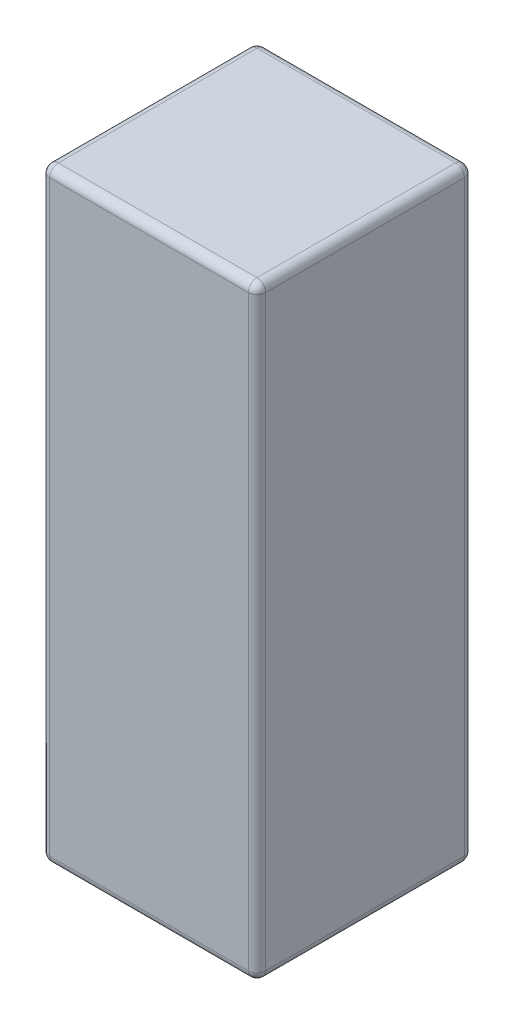
ISO-10303-21;
HEADER;
FILE_DESCRIPTION(('STEP AP214'),'2;1');
FILE_NAME('part.step','',(''),(''),'','','');
FILE_SCHEMA(('AUTOMOTIVE_DESIGN { 1 0 10303 214 1 1 1 1 }'));
ENDSEC;
DATA;
#1=APPLICATION_CONTEXT('core data for automotive mechanical design processes');
#2=APPLICATION_PROTOCOL_DEFINITION('international standard','automotive_design',2000,#1);
#3=PRODUCT_CONTEXT('',#1,'mechanical');
#4=PRODUCT('Part','Part','',(#3));
#5=PRODUCT_RELATED_PRODUCT_CATEGORY('part','',(#4));
#6=PRODUCT_DEFINITION_FORMATION('','',#4);
#7=PRODUCT_DEFINITION_CONTEXT('part definition',#1,'design');
#8=PRODUCT_DEFINITION('design','',#6,#7);
#9=PRODUCT_DEFINITION_SHAPE('','',#8);
#10=(LENGTH_UNIT() NAMED_UNIT(*) SI_UNIT(.MILLI.,.METRE.));
#11=(NAMED_UNIT(*) PLANE_ANGLE_UNIT() SI_UNIT($,.RADIAN.));
#12=(NAMED_UNIT(*) SI_UNIT($,.STERADIAN.) SOLID_ANGLE_UNIT());
#13=UNCERTAINTY_MEASURE_WITH_UNIT(LENGTH_MEASURE(1.E-05),#10,'distance_accuracy_value','');
#14=(GEOMETRIC_REPRESENTATION_CONTEXT(3) GLOBAL_UNCERTAINTY_ASSIGNED_CONTEXT((#13)) GLOBAL_UNIT_ASSIGNED_CONTEXT((#10,
#11,#12)) REPRESENTATION_CONTEXT('',''));
#15=CARTESIAN_POINT('',(0.,0.,0.));
#16=DIRECTION('',(0.,0.,1.));
#17=DIRECTION('',(1.,0.,0.));
#18=AXIS2_PLACEMENT_3D('',#15,#16,#17);
#19=CARTESIAN_POINT('',(25.,70.,25.));
#20=DIRECTION('',(-1.,0.,0.));
#21=DIRECTION('',(0.,0.,1.));
#22=AXIS2_PLACEMENT_3D('',#19,#20,#21);
#23=PLANE('',#22);
#24=DIRECTION('',(0.,0.,-1.));
#25=VECTOR('',#24,1.);
#26=CARTESIAN_POINT('',(25.,-68.,-25.));
#27=LINE('',#26,#25);
#28=CARTESIAN_POINT('',(25.,-68.,23.));
#29=VERTEX_POINT('',#28);
#30=CARTESIAN_POINT('',(25.,-68.,-23.));
#31=VERTEX_POINT('',#30);
#32=EDGE_CURVE('E242',#29,#31,#27,.T.);
#33=ORIENTED_EDGE('',*,*,#32,.T.);
#34=DIRECTION('',(0.,-1.,0.));
#35=VECTOR('',#34,1.);
#36=CARTESIAN_POINT('',(25.,70.,-23.));
#37=LINE('',#36,#35);
#38=CARTESIAN_POINT('',(25.,68.,-23.));
#39=VERTEX_POINT('',#38);
#40=EDGE_CURVE('E189',#31,#39,#37,.F.);
#41=ORIENTED_EDGE('',*,*,#40,.T.);
#42=DIRECTION('',(0.,0.,-1.));
#43=VECTOR('',#42,1.);
#44=CARTESIAN_POINT('',(25.,68.,25.));
#45=LINE('',#44,#43);
#46=CARTESIAN_POINT('',(25.,68.,23.));
#47=VERTEX_POINT('',#46);
#48=EDGE_CURVE('E239',#39,#47,#45,.F.);
#49=ORIENTED_EDGE('',*,*,#48,.T.);
#50=DIRECTION('',(0.,-1.,0.));
#51=VECTOR('',#50,1.);
#52=CARTESIAN_POINT('',(25.,70.,23.));
#53=LINE('',#52,#51);
#54=EDGE_CURVE('E187',#47,#29,#53,.T.);
#55=ORIENTED_EDGE('',*,*,#54,.T.);
#56=EDGE_LOOP('',(#33,#41,#49,#55));
#57=FACE_BOUND('',#56,.T.);
#58=ADVANCED_FACE('F36',(#57),#23,.F.);
#59=CARTESIAN_POINT('',(-25.,70.,-25.));
#60=DIRECTION('',(0.,0.,1.));
#61=DIRECTION('',(1.,0.,0.));
#62=AXIS2_PLACEMENT_3D('',#59,#60,#61);
#63=PLANE('',#62);
#64=DIRECTION('',(-1.,0.,0.));
#65=VECTOR('',#64,1.);
#66=CARTESIAN_POINT('',(-25.,-68.,-25.));
#67=LINE('',#66,#65);
#68=CARTESIAN_POINT('',(23.,-68.,-25.));
#69=VERTEX_POINT('',#68);
#70=CARTESIAN_POINT('',(-23.,-68.,-25.));
#71=VERTEX_POINT('',#70);
#72=EDGE_CURVE('E135',#69,#71,#67,.T.);
#73=ORIENTED_EDGE('',*,*,#72,.T.);
#74=DIRECTION('',(0.,-1.,0.));
#75=VECTOR('',#74,1.);
#76=CARTESIAN_POINT('',(-23.,70.,-25.));
#77=LINE('',#76,#75);
#78=CARTESIAN_POINT('',(-23.,68.,-25.));
#79=VERTEX_POINT('',#78);
#80=EDGE_CURVE('E185',#71,#79,#77,.F.);
#81=ORIENTED_EDGE('',*,*,#80,.T.);
#82=DIRECTION('',(-1.,0.,0.));
#83=VECTOR('',#82,1.);
#84=CARTESIAN_POINT('',(-25.,68.,-25.));
#85=LINE('',#84,#83);
#86=CARTESIAN_POINT('',(23.,68.,-25.));
#87=VERTEX_POINT('',#86);
#88=EDGE_CURVE('E197',#79,#87,#85,.F.);
#89=ORIENTED_EDGE('',*,*,#88,.T.);
#90=DIRECTION('',(0.,-1.,0.));
#91=VECTOR('',#90,1.);
#92=CARTESIAN_POINT('',(23.,70.,-25.));
#93=LINE('',#92,#91);
#94=EDGE_CURVE('E183',#87,#69,#93,.T.);
#95=ORIENTED_EDGE('',*,*,#94,.T.);
#96=EDGE_LOOP('',(#73,#81,#89,#95));
#97=FACE_BOUND('',#96,.T.);
#98=ADVANCED_FACE('F303',(#97),#63,.F.);
#99=CARTESIAN_POINT('',(-25.,70.,25.));
#100=DIRECTION('',(1.,0.,0.));
#101=DIRECTION('',(0.,0.,-1.));
#102=AXIS2_PLACEMENT_3D('',#99,#100,#101);
#103=PLANE('',#102);
#104=DIRECTION('',(0.,0.,1.));
#105=VECTOR('',#104,1.);
#106=CARTESIAN_POINT('',(-25.,68.,25.));
#107=LINE('',#106,#105);
#108=CARTESIAN_POINT('',(-25.,68.,23.));
#109=VERTEX_POINT('',#108);
#110=CARTESIAN_POINT('',(-25.,68.,-23.));
#111=VERTEX_POINT('',#110);
#112=EDGE_CURVE('E160',#109,#111,#107,.F.);
#113=ORIENTED_EDGE('',*,*,#112,.T.);
#114=DIRECTION('',(0.,-1.,0.));
#115=VECTOR('',#114,1.);
#116=CARTESIAN_POINT('',(-25.,70.,-23.));
#117=LINE('',#116,#115);
#118=CARTESIAN_POINT('',(-25.,-68.,-23.));
#119=VERTEX_POINT('',#118);
#120=EDGE_CURVE('E181',#111,#119,#117,.T.);
#121=ORIENTED_EDGE('',*,*,#120,.T.);
#122=DIRECTION('',(0.,0.,1.));
#123=VECTOR('',#122,1.);
#124=CARTESIAN_POINT('',(-25.,-68.,25.));
#125=LINE('',#124,#123);
#126=CARTESIAN_POINT('',(-25.,-68.,23.));
#127=VERTEX_POINT('',#126);
#128=EDGE_CURVE('E234',#119,#127,#125,.T.);
#129=ORIENTED_EDGE('',*,*,#128,.T.);
#130=DIRECTION('',(0.,-1.,0.));
#131=VECTOR('',#130,1.);
#132=CARTESIAN_POINT('',(-25.,70.,23.));
#133=LINE('',#132,#131);
#134=EDGE_CURVE('E179',#127,#109,#133,.F.);
#135=ORIENTED_EDGE('',*,*,#134,.T.);
#136=EDGE_LOOP('',(#113,#121,#129,#135));
#137=FACE_BOUND('',#136,.T.);
#138=ADVANCED_FACE('F299',(#137),#103,.F.);
#139=CARTESIAN_POINT('',(-25.,70.,25.));
#140=DIRECTION('',(0.,0.,-1.));
#141=DIRECTION('',(-1.,0.,0.));
#142=AXIS2_PLACEMENT_3D('',#139,#140,#141);
#143=PLANE('',#142);
#144=DIRECTION('',(1.,0.,0.));
#145=VECTOR('',#144,1.);
#146=CARTESIAN_POINT('',(25.,-68.,25.));
#147=LINE('',#146,#145);
#148=CARTESIAN_POINT('',(-23.,-68.,25.));
#149=VERTEX_POINT('',#148);
#150=CARTESIAN_POINT('',(23.,-68.,25.));
#151=VERTEX_POINT('',#150);
#152=EDGE_CURVE('E222',#149,#151,#147,.T.);
#153=ORIENTED_EDGE('',*,*,#152,.T.);
#154=DIRECTION('',(0.,-1.,0.));
#155=VECTOR('',#154,1.);
#156=CARTESIAN_POINT('',(23.,70.,25.));
#157=LINE('',#156,#155);
#158=CARTESIAN_POINT('',(23.,68.,25.));
#159=VERTEX_POINT('',#158);
#160=EDGE_CURVE('E11',#151,#159,#157,.F.);
#161=ORIENTED_EDGE('',*,*,#160,.T.);
#162=DIRECTION('',(1.,0.,0.));
#163=VECTOR('',#162,1.);
#164=CARTESIAN_POINT('',(-25.,68.,25.));
#165=LINE('',#164,#163);
#166=CARTESIAN_POINT('',(-23.,68.,25.));
#167=VERTEX_POINT('',#166);
#168=EDGE_CURVE('E236',#159,#167,#165,.F.);
#169=ORIENTED_EDGE('',*,*,#168,.T.);
#170=DIRECTION('',(0.,-1.,0.));
#171=VECTOR('',#170,1.);
#172=CARTESIAN_POINT('',(-23.,70.,25.));
#173=LINE('',#172,#171);
#174=EDGE_CURVE('E45',#167,#149,#173,.T.);
#175=ORIENTED_EDGE('',*,*,#174,.T.);
#176=EDGE_LOOP('',(#153,#161,#169,#175));
#177=FACE_BOUND('',#176,.T.);
#178=ADVANCED_FACE('F507',(#177),#143,.F.);
#179=CARTESIAN_POINT('',(0.,70.,0.));
#180=DIRECTION('',(0.,-1.,0.));
#181=DIRECTION('',(0.,0.,-1.));
#182=AXIS2_PLACEMENT_3D('',#179,#180,#181);
#183=PLANE('',#182);
#184=DIRECTION('',(0.,0.,1.));
#185=VECTOR('',#184,1.);
#186=CARTESIAN_POINT('',(-23.,70.,0.));
#187=LINE('',#186,#185);
#188=CARTESIAN_POINT('',(-23.,70.,-23.));
#189=VERTEX_POINT('',#188);
#190=CARTESIAN_POINT('',(-23.,70.,23.));
#191=VERTEX_POINT('',#190);
#192=EDGE_CURVE('E250',#189,#191,#187,.T.);
#193=ORIENTED_EDGE('',*,*,#192,.T.);
#194=DIRECTION('',(1.,0.,0.));
#195=VECTOR('',#194,1.);
#196=CARTESIAN_POINT('',(0.,70.,23.));
#197=LINE('',#196,#195);
#198=CARTESIAN_POINT('',(23.,70.,23.));
#199=VERTEX_POINT('',#198);
#200=EDGE_CURVE('E253',#191,#199,#197,.T.);
#201=ORIENTED_EDGE('',*,*,#200,.T.);
#202=DIRECTION('',(0.,0.,-1.));
#203=VECTOR('',#202,1.);
#204=CARTESIAN_POINT('',(23.,70.,0.));
#205=LINE('',#204,#203);
#206=CARTESIAN_POINT('',(23.,70.,-23.));
#207=VERTEX_POINT('',#206);
#208=EDGE_CURVE('E244',#199,#207,#205,.T.);
#209=ORIENTED_EDGE('',*,*,#208,.T.);
#210=DIRECTION('',(-1.,0.,0.));
#211=VECTOR('',#210,1.);
#212=CARTESIAN_POINT('',(0.,70.,-23.));
#213=LINE('',#212,#211);
#214=EDGE_CURVE('E247',#207,#189,#213,.T.);
#215=ORIENTED_EDGE('',*,*,#214,.T.);
#216=EDGE_LOOP('',(#193,#201,#209,#215));
#217=FACE_BOUND('',#216,.T.);
#218=ADVANCED_FACE('F278',(#217),#183,.F.);
#219=CARTESIAN_POINT('',(0.,-70.,0.));
#220=DIRECTION('',(0.,-1.,0.));
#221=DIRECTION('',(0.,0.,-1.));
#222=AXIS2_PLACEMENT_3D('',#219,#220,#221);
#223=PLANE('',#222);
#224=DIRECTION('',(0.,0.,1.));
#225=VECTOR('',#224,1.);
#226=CARTESIAN_POINT('',(-23.,-70.,-25.));
#227=LINE('',#226,#225);
#228=CARTESIAN_POINT('',(-23.,-70.,23.));
#229=VERTEX_POINT('',#228);
#230=CARTESIAN_POINT('',(-23.,-70.,-23.));
#231=VERTEX_POINT('',#230);
#232=EDGE_CURVE('E159',#229,#231,#227,.F.);
#233=ORIENTED_EDGE('',*,*,#232,.T.);
#234=DIRECTION('',(-1.,0.,0.));
#235=VECTOR('',#234,1.);
#236=CARTESIAN_POINT('',(25.,-70.,-23.));
#237=LINE('',#236,#235);
#238=CARTESIAN_POINT('',(23.,-70.,-23.));
#239=VERTEX_POINT('',#238);
#240=EDGE_CURVE('E132',#231,#239,#237,.F.);
#241=ORIENTED_EDGE('',*,*,#240,.T.);
#242=DIRECTION('',(0.,0.,-1.));
#243=VECTOR('',#242,1.);
#244=CARTESIAN_POINT('',(23.,-70.,25.));
#245=LINE('',#244,#243);
#246=CARTESIAN_POINT('',(23.,-70.,23.));
#247=VERTEX_POINT('',#246);
#248=EDGE_CURVE('E145',#239,#247,#245,.F.);
#249=ORIENTED_EDGE('',*,*,#248,.T.);
#250=DIRECTION('',(1.,0.,0.));
#251=VECTOR('',#250,1.);
#252=CARTESIAN_POINT('',(-25.,-70.,23.));
#253=LINE('',#252,#251);
#254=EDGE_CURVE('E154',#247,#229,#253,.F.);
#255=ORIENTED_EDGE('',*,*,#254,.T.);
#256=EDGE_LOOP('',(#233,#241,#249,#255));
#257=FACE_BOUND('',#256,.T.);
#258=ADVANCED_FACE('F157',(#257),#223,.T.);
#259=CARTESIAN_POINT('',(-25.,-68.,23.));
#260=DIRECTION('',(-1.,0.,0.));
#261=DIRECTION('',(0.,0.,1.));
#262=AXIS2_PLACEMENT_3D('',#259,#260,#261);
#263=CYLINDRICAL_SURFACE('',#262,2.);
#264=ORIENTED_EDGE('',*,*,#254,.F.);
#265=CARTESIAN_POINT('',(23.,-68.,23.));
#266=DIRECTION('',(-1.,0.,0.));
#267=DIRECTION('',(0.,0.,1.));
#268=AXIS2_PLACEMENT_3D('',#265,#266,#267);
#269=CIRCLE('',#268,2.);
#270=EDGE_CURVE('E53',#247,#151,#269,.T.);
#271=ORIENTED_EDGE('',*,*,#270,.T.);
#272=ORIENTED_EDGE('',*,*,#152,.F.);
#273=CARTESIAN_POINT('',(-23.,-68.,23.));
#274=DIRECTION('',(-1.,0.,0.));
#275=DIRECTION('',(0.,0.,1.));
#276=AXIS2_PLACEMENT_3D('',#273,#274,#275);
#277=CIRCLE('',#276,2.);
#278=EDGE_CURVE('E176',#149,#229,#277,.F.);
#279=ORIENTED_EDGE('',*,*,#278,.T.);
#280=EDGE_LOOP('',(#264,#271,#272,#279));
#281=FACE_BOUND('',#280,.T.);
#282=ADVANCED_FACE('F221',(#281),#263,.T.);
#283=CARTESIAN_POINT('',(23.,-68.,25.));
#284=DIRECTION('',(0.,0.,1.));
#285=DIRECTION('',(1.,0.,0.));
#286=AXIS2_PLACEMENT_3D('',#283,#284,#285);
#287=CYLINDRICAL_SURFACE('',#286,2.);
#288=ORIENTED_EDGE('',*,*,#248,.F.);
#289=CARTESIAN_POINT('',(23.,-68.,-23.));
#290=DIRECTION('',(0.,0.,1.));
#291=DIRECTION('',(1.,0.,0.));
#292=AXIS2_PLACEMENT_3D('',#289,#290,#291);
#293=CIRCLE('',#292,2.);
#294=EDGE_CURVE('E148',#239,#31,#293,.T.);
#295=ORIENTED_EDGE('',*,*,#294,.T.);
#296=ORIENTED_EDGE('',*,*,#32,.F.);
#297=CARTESIAN_POINT('',(23.,-68.,23.));
#298=DIRECTION('',(0.,0.,1.));
#299=DIRECTION('',(1.,0.,0.));
#300=AXIS2_PLACEMENT_3D('',#297,#298,#299);
#301=CIRCLE('',#300,2.);
#302=EDGE_CURVE('E151',#29,#247,#301,.F.);
#303=ORIENTED_EDGE('',*,*,#302,.T.);
#304=EDGE_LOOP('',(#288,#295,#296,#303));
#305=FACE_BOUND('',#304,.T.);
#306=ADVANCED_FACE('F146',(#305),#287,.T.);
#307=CARTESIAN_POINT('',(-23.,-68.,25.));
#308=DIRECTION('',(0.,0.,-1.));
#309=DIRECTION('',(-1.,0.,0.));
#310=AXIS2_PLACEMENT_3D('',#307,#308,#309);
#311=CYLINDRICAL_SURFACE('',#310,2.);
#312=ORIENTED_EDGE('',*,*,#128,.F.);
#313=CARTESIAN_POINT('',(-23.,-68.,-23.));
#314=DIRECTION('',(0.,0.,-1.));
#315=DIRECTION('',(-1.,0.,0.));
#316=AXIS2_PLACEMENT_3D('',#313,#314,#315);
#317=CIRCLE('',#316,2.);
#318=EDGE_CURVE('E229',#119,#231,#317,.F.);
#319=ORIENTED_EDGE('',*,*,#318,.T.);
#320=ORIENTED_EDGE('',*,*,#232,.F.);
#321=CARTESIAN_POINT('',(-23.,-68.,23.));
#322=DIRECTION('',(0.,0.,-1.));
#323=DIRECTION('',(-1.,0.,0.));
#324=AXIS2_PLACEMENT_3D('',#321,#322,#323);
#325=CIRCLE('',#324,2.);
#326=EDGE_CURVE('E220',#229,#127,#325,.T.);
#327=ORIENTED_EDGE('',*,*,#326,.T.);
#328=EDGE_LOOP('',(#312,#319,#320,#327));
#329=FACE_BOUND('',#328,.T.);
#330=ADVANCED_FACE('F226',(#329),#311,.T.);
#331=CARTESIAN_POINT('',(-25.,-68.,-23.));
#332=DIRECTION('',(1.,0.,0.));
#333=DIRECTION('',(0.,0.,-1.));
#334=AXIS2_PLACEMENT_3D('',#331,#332,#333);
#335=CYLINDRICAL_SURFACE('',#334,2.);
#336=ORIENTED_EDGE('',*,*,#240,.F.);
#337=CARTESIAN_POINT('',(-23.,-68.,-23.));
#338=DIRECTION('',(1.,0.,0.));
#339=DIRECTION('',(0.,0.,-1.));
#340=AXIS2_PLACEMENT_3D('',#337,#338,#339);
#341=CIRCLE('',#340,2.);
#342=EDGE_CURVE('E140',#231,#71,#341,.T.);
#343=ORIENTED_EDGE('',*,*,#342,.T.);
#344=ORIENTED_EDGE('',*,*,#72,.F.);
#345=CARTESIAN_POINT('',(23.,-68.,-23.));
#346=DIRECTION('',(1.,0.,0.));
#347=DIRECTION('',(0.,0.,-1.));
#348=AXIS2_PLACEMENT_3D('',#345,#346,#347);
#349=CIRCLE('',#348,2.);
#350=EDGE_CURVE('E128',#69,#239,#349,.F.);
#351=ORIENTED_EDGE('',*,*,#350,.T.);
#352=EDGE_LOOP('',(#336,#343,#344,#351));
#353=FACE_BOUND('',#352,.T.);
#354=ADVANCED_FACE('F130',(#353),#335,.T.);
#355=CARTESIAN_POINT('',(0.,68.,-23.));
#356=DIRECTION('',(-1.,0.,0.));
#357=DIRECTION('',(0.,0.,1.));
#358=AXIS2_PLACEMENT_3D('',#355,#356,#357);
#359=CYLINDRICAL_SURFACE('',#358,2.);
#360=ORIENTED_EDGE('',*,*,#88,.F.);
#361=CARTESIAN_POINT('',(-23.,68.,-23.));
#362=DIRECTION('',(-1.,0.,0.));
#363=DIRECTION('',(0.,0.,1.));
#364=AXIS2_PLACEMENT_3D('',#361,#362,#363);
#365=CIRCLE('',#364,2.);
#366=EDGE_CURVE('E141',#79,#189,#365,.F.);
#367=ORIENTED_EDGE('',*,*,#366,.T.);
#368=ORIENTED_EDGE('',*,*,#214,.F.);
#369=CARTESIAN_POINT('',(23.,68.,-23.));
#370=DIRECTION('',(-1.,0.,0.));
#371=DIRECTION('',(0.,0.,1.));
#372=AXIS2_PLACEMENT_3D('',#369,#370,#371);
#373=CIRCLE('',#372,2.);
#374=EDGE_CURVE('E261',#207,#87,#373,.T.);
#375=ORIENTED_EDGE('',*,*,#374,.T.);
#376=EDGE_LOOP('',(#360,#367,#368,#375));
#377=FACE_BOUND('',#376,.T.);
#378=ADVANCED_FACE('F283',(#377),#359,.T.);
#379=CARTESIAN_POINT('',(-23.,68.,0.));
#380=DIRECTION('',(0.,0.,1.));
#381=DIRECTION('',(1.,0.,0.));
#382=AXIS2_PLACEMENT_3D('',#379,#380,#381);
#383=CYLINDRICAL_SURFACE('',#382,2.);
#384=ORIENTED_EDGE('',*,*,#192,.F.);
#385=CARTESIAN_POINT('',(-23.,68.,-23.));
#386=DIRECTION('',(0.,0.,1.));
#387=DIRECTION('',(1.,0.,0.));
#388=AXIS2_PLACEMENT_3D('',#385,#386,#387);
#389=CIRCLE('',#388,2.);
#390=EDGE_CURVE('E258',#189,#111,#389,.T.);
#391=ORIENTED_EDGE('',*,*,#390,.T.);
#392=ORIENTED_EDGE('',*,*,#112,.F.);
#393=CARTESIAN_POINT('',(-23.,68.,23.));
#394=DIRECTION('',(0.,0.,1.));
#395=DIRECTION('',(1.,0.,0.));
#396=AXIS2_PLACEMENT_3D('',#393,#394,#395);
#397=CIRCLE('',#396,2.);
#398=EDGE_CURVE('E256',#109,#191,#397,.F.);
#399=ORIENTED_EDGE('',*,*,#398,.T.);
#400=EDGE_LOOP('',(#384,#391,#392,#399));
#401=FACE_BOUND('',#400,.T.);
#402=ADVANCED_FACE('F298',(#401),#383,.T.);
#403=CARTESIAN_POINT('',(23.,68.,0.));
#404=DIRECTION('',(0.,0.,-1.));
#405=DIRECTION('',(-1.,0.,0.));
#406=AXIS2_PLACEMENT_3D('',#403,#404,#405);
#407=CYLINDRICAL_SURFACE('',#406,2.);
#408=ORIENTED_EDGE('',*,*,#48,.F.);
#409=CARTESIAN_POINT('',(23.,68.,-23.));
#410=DIRECTION('',(0.,0.,-1.));
#411=DIRECTION('',(-1.,0.,0.));
#412=AXIS2_PLACEMENT_3D('',#409,#410,#411);
#413=CIRCLE('',#412,2.);
#414=EDGE_CURVE('E170',#39,#207,#413,.F.);
#415=ORIENTED_EDGE('',*,*,#414,.T.);
#416=ORIENTED_EDGE('',*,*,#208,.F.);
#417=CARTESIAN_POINT('',(23.,68.,23.));
#418=DIRECTION('',(0.,0.,-1.));
#419=DIRECTION('',(-1.,0.,0.));
#420=AXIS2_PLACEMENT_3D('',#417,#418,#419);
#421=CIRCLE('',#420,2.);
#422=EDGE_CURVE('E267',#199,#47,#421,.T.);
#423=ORIENTED_EDGE('',*,*,#422,.T.);
#424=EDGE_LOOP('',(#408,#415,#416,#423));
#425=FACE_BOUND('',#424,.T.);
#426=ADVANCED_FACE('F273',(#425),#407,.T.);
#427=CARTESIAN_POINT('',(0.,68.,23.));
#428=DIRECTION('',(1.,0.,0.));
#429=DIRECTION('',(0.,0.,-1.));
#430=AXIS2_PLACEMENT_3D('',#427,#428,#429);
#431=CYLINDRICAL_SURFACE('',#430,2.);
#432=ORIENTED_EDGE('',*,*,#168,.F.);
#433=CARTESIAN_POINT('',(23.,68.,23.));
#434=DIRECTION('',(1.,0.,0.));
#435=DIRECTION('',(0.,0.,-1.));
#436=AXIS2_PLACEMENT_3D('',#433,#434,#435);
#437=CIRCLE('',#436,2.);
#438=EDGE_CURVE('E168',#159,#199,#437,.F.);
#439=ORIENTED_EDGE('',*,*,#438,.T.);
#440=ORIENTED_EDGE('',*,*,#200,.F.);
#441=CARTESIAN_POINT('',(-23.,68.,23.));
#442=DIRECTION('',(1.,0.,0.));
#443=DIRECTION('',(0.,0.,-1.));
#444=AXIS2_PLACEMENT_3D('',#441,#442,#443);
#445=CIRCLE('',#444,2.);
#446=EDGE_CURVE('E165',#191,#167,#445,.T.);
#447=ORIENTED_EDGE('',*,*,#446,.T.);
#448=EDGE_LOOP('',(#432,#439,#440,#447));
#449=FACE_BOUND('',#448,.T.);
#450=ADVANCED_FACE('F339',(#449),#431,.T.);
#451=CARTESIAN_POINT('',(-23.,-68.,-23.));
#452=DIRECTION('',(0.,0.,1.));
#453=DIRECTION('',(1.,0.,0.));
#454=AXIS2_PLACEMENT_3D('',#451,#452,#453);
#455=SPHERICAL_SURFACE('',#454,2.);
#456=ORIENTED_EDGE('',*,*,#342,.F.);
#457=ORIENTED_EDGE('',*,*,#318,.F.);
#458=CARTESIAN_POINT('',(-23.,-68.,-23.));
#459=DIRECTION('',(0.,1.,0.));
#460=DIRECTION('',(0.,0.,1.));
#461=AXIS2_PLACEMENT_3D('',#458,#459,#460);
#462=CIRCLE('',#461,2.);
#463=EDGE_CURVE('E194',#71,#119,#462,.T.);
#464=ORIENTED_EDGE('',*,*,#463,.F.);
#465=EDGE_LOOP('',(#456,#457,#464));
#466=FACE_BOUND('',#465,.T.);
#467=ADVANCED_FACE('F301',(#466),#455,.T.);
#468=CARTESIAN_POINT('',(-23.,70.,-23.));
#469=DIRECTION('',(0.,-1.,0.));
#470=DIRECTION('',(0.,0.,-1.));
#471=AXIS2_PLACEMENT_3D('',#468,#469,#470);
#472=CYLINDRICAL_SURFACE('',#471,2.);
#473=ORIENTED_EDGE('',*,*,#463,.T.);
#474=ORIENTED_EDGE('',*,*,#120,.F.);
#475=CARTESIAN_POINT('',(-23.,68.,-23.));
#476=DIRECTION('',(0.,1.,0.));
#477=DIRECTION('',(0.,0.,1.));
#478=AXIS2_PLACEMENT_3D('',#475,#476,#477);
#479=CIRCLE('',#478,2.);
#480=EDGE_CURVE('E192',#79,#111,#479,.T.);
#481=ORIENTED_EDGE('',*,*,#480,.F.);
#482=ORIENTED_EDGE('',*,*,#80,.F.);
#483=EDGE_LOOP('',(#473,#474,#481,#482));
#484=FACE_BOUND('',#483,.T.);
#485=ADVANCED_FACE('F293',(#484),#472,.T.);
#486=CARTESIAN_POINT('',(-23.,68.,-23.));
#487=DIRECTION('',(0.,0.,1.));
#488=DIRECTION('',(1.,0.,0.));
#489=AXIS2_PLACEMENT_3D('',#486,#487,#488);
#490=SPHERICAL_SURFACE('',#489,2.);
#491=ORIENTED_EDGE('',*,*,#390,.F.);
#492=ORIENTED_EDGE('',*,*,#366,.F.);
#493=ORIENTED_EDGE('',*,*,#480,.T.);
#494=EDGE_LOOP('',(#491,#492,#493));
#495=FACE_BOUND('',#494,.T.);
#496=ADVANCED_FACE('F289',(#495),#490,.T.);
#497=CARTESIAN_POINT('',(23.,-68.,-23.));
#498=DIRECTION('',(0.,0.,1.));
#499=DIRECTION('',(1.,0.,0.));
#500=AXIS2_PLACEMENT_3D('',#497,#498,#499);
#501=SPHERICAL_SURFACE('',#500,2.);
#502=ORIENTED_EDGE('',*,*,#294,.F.);
#503=ORIENTED_EDGE('',*,*,#350,.F.);
#504=CARTESIAN_POINT('',(23.,-68.,-23.));
#505=DIRECTION('',(0.,1.,0.));
#506=DIRECTION('',(0.,0.,1.));
#507=AXIS2_PLACEMENT_3D('',#504,#505,#506);
#508=CIRCLE('',#507,2.);
#509=EDGE_CURVE('E163',#31,#69,#508,.T.);
#510=ORIENTED_EDGE('',*,*,#509,.F.);
#511=EDGE_LOOP('',(#502,#503,#510));
#512=FACE_BOUND('',#511,.T.);
#513=ADVANCED_FACE('F162',(#512),#501,.T.);
#514=CARTESIAN_POINT('',(23.,70.,-23.));
#515=DIRECTION('',(0.,-1.,0.));
#516=DIRECTION('',(0.,0.,-1.));
#517=AXIS2_PLACEMENT_3D('',#514,#515,#516);
#518=CYLINDRICAL_SURFACE('',#517,2.);
#519=ORIENTED_EDGE('',*,*,#509,.T.);
#520=ORIENTED_EDGE('',*,*,#94,.F.);
#521=CARTESIAN_POINT('',(23.,68.,-23.));
#522=DIRECTION('',(0.,1.,0.));
#523=DIRECTION('',(0.,0.,1.));
#524=AXIS2_PLACEMENT_3D('',#521,#522,#523);
#525=CIRCLE('',#524,2.);
#526=EDGE_CURVE('E198',#39,#87,#525,.T.);
#527=ORIENTED_EDGE('',*,*,#526,.F.);
#528=ORIENTED_EDGE('',*,*,#40,.F.);
#529=EDGE_LOOP('',(#519,#520,#527,#528));
#530=FACE_BOUND('',#529,.T.);
#531=ADVANCED_FACE('F308',(#530),#518,.T.);
#532=CARTESIAN_POINT('',(23.,68.,-23.));
#533=DIRECTION('',(0.,0.,1.));
#534=DIRECTION('',(1.,0.,0.));
#535=AXIS2_PLACEMENT_3D('',#532,#533,#534);
#536=SPHERICAL_SURFACE('',#535,2.);
#537=ORIENTED_EDGE('',*,*,#526,.T.);
#538=ORIENTED_EDGE('',*,*,#374,.F.);
#539=ORIENTED_EDGE('',*,*,#414,.F.);
#540=EDGE_LOOP('',(#537,#538,#539));
#541=FACE_BOUND('',#540,.T.);
#542=ADVANCED_FACE('F309',(#541),#536,.T.);
#543=CARTESIAN_POINT('',(23.,-68.,23.));
#544=DIRECTION('',(0.,0.,1.));
#545=DIRECTION('',(1.,0.,0.));
#546=AXIS2_PLACEMENT_3D('',#543,#544,#545);
#547=SPHERICAL_SURFACE('',#546,2.);
#548=ORIENTED_EDGE('',*,*,#270,.F.);
#549=ORIENTED_EDGE('',*,*,#302,.F.);
#550=CARTESIAN_POINT('',(23.,-68.,23.));
#551=DIRECTION('',(0.,1.,0.));
#552=DIRECTION('',(0.,0.,1.));
#553=AXIS2_PLACEMENT_3D('',#550,#551,#552);
#554=CIRCLE('',#553,2.);
#555=EDGE_CURVE('E201',#151,#29,#554,.T.);
#556=ORIENTED_EDGE('',*,*,#555,.F.);
#557=EDGE_LOOP('',(#548,#549,#556));
#558=FACE_BOUND('',#557,.T.);
#559=ADVANCED_FACE('F311',(#558),#547,.T.);
#560=CARTESIAN_POINT('',(23.,70.,23.));
#561=DIRECTION('',(0.,-1.,0.));
#562=DIRECTION('',(0.,0.,-1.));
#563=AXIS2_PLACEMENT_3D('',#560,#561,#562);
#564=CYLINDRICAL_SURFACE('',#563,2.);
#565=ORIENTED_EDGE('',*,*,#555,.T.);
#566=ORIENTED_EDGE('',*,*,#54,.F.);
#567=CARTESIAN_POINT('',(23.,68.,23.));
#568=DIRECTION('',(0.,1.,0.));
#569=DIRECTION('',(0.,0.,1.));
#570=AXIS2_PLACEMENT_3D('',#567,#568,#569);
#571=CIRCLE('',#570,2.);
#572=EDGE_CURVE('E203',#159,#47,#571,.T.);
#573=ORIENTED_EDGE('',*,*,#572,.F.);
#574=ORIENTED_EDGE('',*,*,#160,.F.);
#575=EDGE_LOOP('',(#565,#566,#573,#574));
#576=FACE_BOUND('',#575,.T.);
#577=ADVANCED_FACE('F317',(#576),#564,.T.);
#578=CARTESIAN_POINT('',(23.,68.,23.));
#579=DIRECTION('',(0.,0.,1.));
#580=DIRECTION('',(1.,0.,0.));
#581=AXIS2_PLACEMENT_3D('',#578,#579,#580);
#582=SPHERICAL_SURFACE('',#581,2.);
#583=ORIENTED_EDGE('',*,*,#572,.T.);
#584=ORIENTED_EDGE('',*,*,#422,.F.);
#585=ORIENTED_EDGE('',*,*,#438,.F.);
#586=EDGE_LOOP('',(#583,#584,#585));
#587=FACE_BOUND('',#586,.T.);
#588=ADVANCED_FACE('F396',(#587),#582,.T.);
#589=CARTESIAN_POINT('',(-23.,-68.,23.));
#590=DIRECTION('',(0.,0.,1.));
#591=DIRECTION('',(1.,0.,0.));
#592=AXIS2_PLACEMENT_3D('',#589,#590,#591);
#593=SPHERICAL_SURFACE('',#592,2.);
#594=ORIENTED_EDGE('',*,*,#326,.F.);
#595=ORIENTED_EDGE('',*,*,#278,.F.);
#596=CARTESIAN_POINT('',(-23.,-68.,23.));
#597=DIRECTION('',(0.,1.,0.));
#598=DIRECTION('',(0.,0.,1.));
#599=AXIS2_PLACEMENT_3D('',#596,#597,#598);
#600=CIRCLE('',#599,2.);
#601=EDGE_CURVE('E40',#127,#149,#600,.T.);
#602=ORIENTED_EDGE('',*,*,#601,.F.);
#603=EDGE_LOOP('',(#594,#595,#602));
#604=FACE_BOUND('',#603,.T.);
#605=ADVANCED_FACE('F38',(#604),#593,.T.);
#606=CARTESIAN_POINT('',(-23.,70.,23.));
#607=DIRECTION('',(0.,-1.,0.));
#608=DIRECTION('',(0.,0.,-1.));
#609=AXIS2_PLACEMENT_3D('',#606,#607,#608);
#610=CYLINDRICAL_SURFACE('',#609,2.);
#611=ORIENTED_EDGE('',*,*,#601,.T.);
#612=ORIENTED_EDGE('',*,*,#174,.F.);
#613=CARTESIAN_POINT('',(-23.,68.,23.));
#614=DIRECTION('',(0.,1.,0.));
#615=DIRECTION('',(0.,0.,1.));
#616=AXIS2_PLACEMENT_3D('',#613,#614,#615);
#617=CIRCLE('',#616,2.);
#618=EDGE_CURVE('E207',#109,#167,#617,.T.);
#619=ORIENTED_EDGE('',*,*,#618,.F.);
#620=ORIENTED_EDGE('',*,*,#134,.F.);
#621=EDGE_LOOP('',(#611,#612,#619,#620));
#622=FACE_BOUND('',#621,.T.);
#623=ADVANCED_FACE('F216',(#622),#610,.T.);
#624=CARTESIAN_POINT('',(-23.,68.,23.));
#625=DIRECTION('',(0.,0.,1.));
#626=DIRECTION('',(1.,0.,0.));
#627=AXIS2_PLACEMENT_3D('',#624,#625,#626);
#628=SPHERICAL_SURFACE('',#627,2.);
#629=ORIENTED_EDGE('',*,*,#446,.F.);
#630=ORIENTED_EDGE('',*,*,#398,.F.);
#631=ORIENTED_EDGE('',*,*,#618,.T.);
#632=EDGE_LOOP('',(#629,#630,#631));
#633=FACE_BOUND('',#632,.T.);
#634=ADVANCED_FACE('F424',(#633),#628,.T.);
#635=CLOSED_SHELL('',(#58,#98,#138,#178,#218,#258,#282,#306,#330,#354,#378,#402,#426,#450,#467,
#485,#496,#513,#531,#542,#559,#577,#588,#605,#623,#634));
#636=MANIFOLD_SOLID_BREP('B2',#635);
#637=ADVANCED_BREP_SHAPE_REPRESENTATION('',(#18,#636),#14);
#638=SHAPE_DEFINITION_REPRESENTATION(#9,#637);
ENDSEC;
END-ISO-10303-21;
